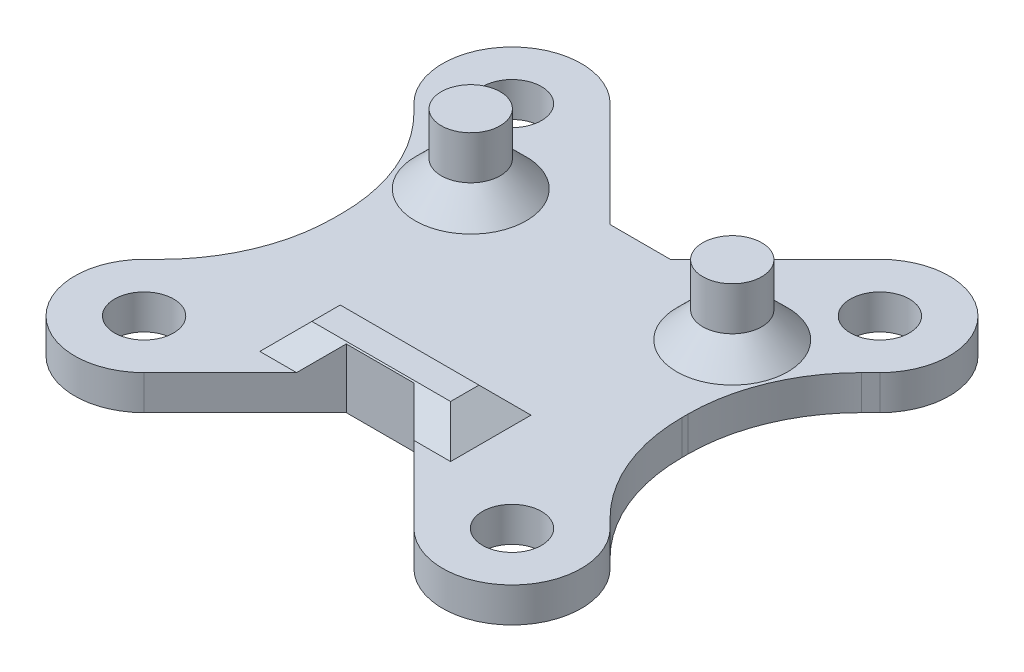
ISO-10303-21;
HEADER;
FILE_DESCRIPTION(('STEP AP214'),'2;1');
FILE_NAME('part.step','',(''),(''),'','','');
FILE_SCHEMA(('AUTOMOTIVE_DESIGN { 1 0 10303 214 1 1 1 1 }'));
ENDSEC;
DATA;
#1=APPLICATION_CONTEXT('core data for automotive mechanical design processes');
#2=APPLICATION_PROTOCOL_DEFINITION('international standard','automotive_design',2000,#1);
#3=PRODUCT_CONTEXT('',#1,'mechanical');
#4=PRODUCT('Part','Part','',(#3));
#5=PRODUCT_RELATED_PRODUCT_CATEGORY('part','',(#4));
#6=PRODUCT_DEFINITION_FORMATION('','',#4);
#7=PRODUCT_DEFINITION_CONTEXT('part definition',#1,'design');
#8=PRODUCT_DEFINITION('design','',#6,#7);
#9=PRODUCT_DEFINITION_SHAPE('','',#8);
#10=(LENGTH_UNIT() NAMED_UNIT(*) SI_UNIT(.MILLI.,.METRE.));
#11=(NAMED_UNIT(*) PLANE_ANGLE_UNIT() SI_UNIT($,.RADIAN.));
#12=(NAMED_UNIT(*) SI_UNIT($,.STERADIAN.) SOLID_ANGLE_UNIT());
#13=UNCERTAINTY_MEASURE_WITH_UNIT(LENGTH_MEASURE(1.E-05),#10,'distance_accuracy_value','');
#14=(GEOMETRIC_REPRESENTATION_CONTEXT(3) GLOBAL_UNCERTAINTY_ASSIGNED_CONTEXT((#13)) GLOBAL_UNIT_ASSIGNED_CONTEXT((#10,
#11,#12)) REPRESENTATION_CONTEXT('',''));
#15=CARTESIAN_POINT('',(0.,0.,0.));
#16=DIRECTION('',(0.,0.,1.));
#17=DIRECTION('',(1.,0.,0.));
#18=AXIS2_PLACEMENT_3D('',#15,#16,#17);
#19=CARTESIAN_POINT('',(10.6066017177982,2.,-10.6066017177983));
#20=DIRECTION('',(0.,1.,0.));
#21=DIRECTION('',(0.,0.,1.));
#22=AXIS2_PLACEMENT_3D('',#19,#20,#21);
#23=PLANE('',#22);
#24=DIRECTION('',(0.707106781186548,0.,-0.707106781186547));
#25=VECTOR('',#24,1.);
#26=CARTESIAN_POINT('',(-7.77817459305203,2.,13.4350288425443));
#27=LINE('',#26,#25);
#28=CARTESIAN_POINT('',(-7.77817459305203,2.,13.4350288425443));
#29=VERTEX_POINT('',#28);
#30=CARTESIAN_POINT('',(-3.38314575050772,2.,9.04));
#31=VERTEX_POINT('',#30);
#32=EDGE_CURVE('E318',#29,#31,#27,.T.);
#33=ORIENTED_EDGE('',*,*,#32,.T.);
#34=DIRECTION('',(-1.,0.,0.));
#35=VECTOR('',#34,1.);
#36=CARTESIAN_POINT('',(10.6066017177982,2.,9.04));
#37=LINE('',#36,#35);
#38=CARTESIAN_POINT('',(-5.49999999999999,2.,9.04));
#39=VERTEX_POINT('',#38);
#40=EDGE_CURVE('E522',#31,#39,#37,.T.);
#41=ORIENTED_EDGE('',*,*,#40,.T.);
#42=DIRECTION('',(0.,0.,-1.));
#43=VECTOR('',#42,1.);
#44=CARTESIAN_POINT('',(-5.49999999999999,2.,5.9040647699451));
#45=LINE('',#44,#43);
#46=CARTESIAN_POINT('',(-5.49999999999999,2.,4.4040647699451));
#47=VERTEX_POINT('',#46);
#48=EDGE_CURVE('E519',#39,#47,#45,.T.);
#49=ORIENTED_EDGE('',*,*,#48,.T.);
#50=DIRECTION('',(1.,0.,0.));
#51=VECTOR('',#50,1.);
#52=CARTESIAN_POINT('',(4.00000000000001,2.,4.4040647699451));
#53=LINE('',#52,#51);
#54=CARTESIAN_POINT('',(5.5,2.,4.4040647699451));
#55=VERTEX_POINT('',#54);
#56=EDGE_CURVE('E515',#47,#55,#53,.T.);
#57=ORIENTED_EDGE('',*,*,#56,.T.);
#58=DIRECTION('',(0.,0.,1.));
#59=VECTOR('',#58,1.);
#60=CARTESIAN_POINT('',(5.5,2.,-10.6066017177983));
#61=LINE('',#60,#59);
#62=CARTESIAN_POINT('',(5.5,2.,9.04));
#63=VERTEX_POINT('',#62);
#64=EDGE_CURVE('E510',#55,#63,#61,.T.);
#65=ORIENTED_EDGE('',*,*,#64,.T.);
#66=DIRECTION('',(-1.,0.,0.));
#67=VECTOR('',#66,1.);
#68=CARTESIAN_POINT('',(10.6066017177982,2.,9.04));
#69=LINE('',#68,#67);
#70=CARTESIAN_POINT('',(3.38314575050756,2.,9.04));
#71=VERTEX_POINT('',#70);
#72=EDGE_CURVE('E236',#63,#71,#69,.T.);
#73=ORIENTED_EDGE('',*,*,#72,.T.);
#74=DIRECTION('',(0.707106781186544,0.,0.707106781186551));
#75=VECTOR('',#74,1.);
#76=CARTESIAN_POINT('',(1.94974746830584,2.,7.60660171779826));
#77=LINE('',#76,#75);
#78=CARTESIAN_POINT('',(7.77817459305195,2.,13.4350288425444));
#79=VERTEX_POINT('',#78);
#80=EDGE_CURVE('E315',#71,#79,#77,.T.);
#81=ORIENTED_EDGE('',*,*,#80,.T.);
#82=CARTESIAN_POINT('',(10.6066017177982,2.,10.6066017177983));
#83=DIRECTION('',(0.,1.,0.));
#84=DIRECTION('',(0.,0.,1.));
#85=AXIS2_PLACEMENT_3D('',#82,#83,#84);
#86=CIRCLE('',#85,4.);
#87=CARTESIAN_POINT('',(13.4350288425444,2.,7.77817459305208));
#88=VERTEX_POINT('',#87);
#89=EDGE_CURVE('E311',#79,#88,#86,.T.);
#90=ORIENTED_EDGE('',*,*,#89,.T.);
#91=DIRECTION('',(0.707106781186546,0.,0.707106781186549));
#92=VECTOR('',#91,1.);
#93=CARTESIAN_POINT('',(9.97136734953961,2.,4.31451310004731));
#94=LINE('',#93,#92);
#95=CARTESIAN_POINT('',(12.9002995376741,2.,7.24344528818184));
#96=VERTEX_POINT('',#95);
#97=EDGE_CURVE('E308',#96,#88,#94,.T.);
#98=ORIENTED_EDGE('',*,*,#97,.F.);
#99=CARTESIAN_POINT('',(19.9713673495396,2.,0.172377476316383));
#100=DIRECTION('',(0.,1.,0.));
#101=DIRECTION('',(0.,0.,1.));
#102=AXIS2_PLACEMENT_3D('',#99,#100,#101);
#103=CIRCLE('',#102,10.);
#104=CARTESIAN_POINT('',(9.97136734953962,2.,0.172377476316366));
#105=VERTEX_POINT('',#104);
#106=EDGE_CURVE('E479',#96,#105,#103,.F.);
#107=ORIENTED_EDGE('',*,*,#106,.T.);
#108=DIRECTION('',(0.,0.,-1.));
#109=VECTOR('',#108,1.);
#110=CARTESIAN_POINT('',(9.97136734953961,2.,4.31451310004731));
#111=LINE('',#110,#109);
#112=CARTESIAN_POINT('',(9.97136734953962,2.,-0.172377476316413));
#113=VERTEX_POINT('',#112);
#114=EDGE_CURVE('E304',#105,#113,#111,.T.);
#115=ORIENTED_EDGE('',*,*,#114,.T.);
#116=CARTESIAN_POINT('',(19.9713673495396,2.,-0.172377476316397));
#117=DIRECTION('',(0.,1.,0.));
#118=DIRECTION('',(0.,0.,1.));
#119=AXIS2_PLACEMENT_3D('',#116,#117,#118);
#120=CIRCLE('',#119,10.);
#121=CARTESIAN_POINT('',(12.9002995376741,2.,-7.24344528818187));
#122=VERTEX_POINT('',#121);
#123=EDGE_CURVE('E473',#113,#122,#120,.F.);
#124=ORIENTED_EDGE('',*,*,#123,.T.);
#125=DIRECTION('',(0.707106781186547,0.,-0.707106781186548));
#126=VECTOR('',#125,1.);
#127=CARTESIAN_POINT('',(9.97136734953963,2.,-4.31451310004735));
#128=LINE('',#127,#126);
#129=CARTESIAN_POINT('',(13.4350288425444,2.,-7.77817459305211));
#130=VERTEX_POINT('',#129);
#131=EDGE_CURVE('E301',#122,#130,#128,.T.);
#132=ORIENTED_EDGE('',*,*,#131,.T.);
#133=CARTESIAN_POINT('',(10.6066017177982,2.,-10.6066017177983));
#134=DIRECTION('',(0.,1.,0.));
#135=DIRECTION('',(0.,0.,1.));
#136=AXIS2_PLACEMENT_3D('',#133,#134,#135);
#137=CIRCLE('',#136,4.);
#138=CARTESIAN_POINT('',(7.77817459305204,2.,-13.4350288425445));
#139=VERTEX_POINT('',#138);
#140=EDGE_CURVE('E297',#130,#139,#137,.T.);
#141=ORIENTED_EDGE('',*,*,#140,.T.);
#142=DIRECTION('',(0.707106781186548,0.,-0.707106781186547));
#143=VECTOR('',#142,1.);
#144=CARTESIAN_POINT('',(1.7365440327093,2.,-7.39339828220179));
#145=LINE('',#144,#143);
#146=CARTESIAN_POINT('',(1.7365440327093,2.,-7.39339828220179));
#147=VERTEX_POINT('',#146);
#148=EDGE_CURVE('E293',#147,#139,#145,.T.);
#149=ORIENTED_EDGE('',*,*,#148,.F.);
#150=DIRECTION('',(-1.,0.,0.));
#151=VECTOR('',#150,1.);
#152=CARTESIAN_POINT('',(1.7365440327093,2.,-7.39339828220179));
#153=LINE('',#152,#151);
#154=CARTESIAN_POINT('',(-1.73654403270938,2.,-7.39339828220181));
#155=VERTEX_POINT('',#154);
#156=EDGE_CURVE('E344',#147,#155,#153,.T.);
#157=ORIENTED_EDGE('',*,*,#156,.T.);
#158=DIRECTION('',(0.707106781186544,0.,0.707106781186551));
#159=VECTOR('',#158,1.);
#160=CARTESIAN_POINT('',(-7.77817459305195,2.,-13.4350288425444));
#161=LINE('',#160,#159);
#162=CARTESIAN_POINT('',(-7.77817459305195,2.,-13.4350288425444));
#163=VERTEX_POINT('',#162);
#164=EDGE_CURVE('E340',#163,#155,#161,.T.);
#165=ORIENTED_EDGE('',*,*,#164,.F.);
#166=CARTESIAN_POINT('',(-10.6066017177982,2.,-10.6066017177983));
#167=DIRECTION('',(0.,1.,0.));
#168=DIRECTION('',(0.,0.,1.));
#169=AXIS2_PLACEMENT_3D('',#166,#167,#168);
#170=CIRCLE('',#169,4.);
#171=CARTESIAN_POINT('',(-13.4350288425444,2.,-7.77817459305209));
#172=VERTEX_POINT('',#171);
#173=EDGE_CURVE('E337',#163,#172,#170,.T.);
#174=ORIENTED_EDGE('',*,*,#173,.T.);
#175=DIRECTION('',(0.707106781186543,0.,0.707106781186552));
#176=VECTOR('',#175,1.);
#177=CARTESIAN_POINT('',(-13.4350288425444,2.,-7.77817459305209));
#178=LINE('',#177,#176);
#179=CARTESIAN_POINT('',(-12.9575648385949,2.,-7.30071058910259));
#180=VERTEX_POINT('',#179);
#181=EDGE_CURVE('E333',#172,#180,#178,.T.);
#182=ORIENTED_EDGE('',*,*,#181,.T.);
#183=CARTESIAN_POINT('',(-20.0286326504604,2.,-0.229642777237154));
#184=DIRECTION('',(0.,1.,0.));
#185=DIRECTION('',(0.,0.,1.));
#186=AXIS2_PLACEMENT_3D('',#183,#184,#185);
#187=CIRCLE('',#186,10.);
#188=CARTESIAN_POINT('',(-10.0286326504604,2.,-0.229642777237154));
#189=VERTEX_POINT('',#188);
#190=EDGE_CURVE('E491',#180,#189,#187,.F.);
#191=ORIENTED_EDGE('',*,*,#190,.T.);
#192=DIRECTION('',(0.,0.,-1.));
#193=VECTOR('',#192,1.);
#194=CARTESIAN_POINT('',(-10.0286326504604,2.,4.37177840096789));
#195=LINE('',#194,#193);
#196=CARTESIAN_POINT('',(-10.0286326504604,2.,0.229642777236943));
#197=VERTEX_POINT('',#196);
#198=EDGE_CURVE('E329',#197,#189,#195,.T.);
#199=ORIENTED_EDGE('',*,*,#198,.F.);
#200=CARTESIAN_POINT('',(-20.0286326504604,2.,0.229642777236943));
#201=DIRECTION('',(0.,1.,0.));
#202=DIRECTION('',(0.,0.,1.));
#203=AXIS2_PLACEMENT_3D('',#200,#201,#202);
#204=CIRCLE('',#203,10.);
#205=CARTESIAN_POINT('',(-12.9575648385949,2.,7.30071058910242));
#206=VERTEX_POINT('',#205);
#207=EDGE_CURVE('E485',#197,#206,#204,.F.);
#208=ORIENTED_EDGE('',*,*,#207,.T.);
#209=DIRECTION('',(0.707106781186548,0.,-0.707106781186547));
#210=VECTOR('',#209,1.);
#211=CARTESIAN_POINT('',(-13.4350288425444,2.,7.77817459305193));
#212=LINE('',#211,#210);
#213=CARTESIAN_POINT('',(-13.4350288425444,2.,7.77817459305193));
#214=VERTEX_POINT('',#213);
#215=EDGE_CURVE('E325',#214,#206,#212,.T.);
#216=ORIENTED_EDGE('',*,*,#215,.F.);
#217=CARTESIAN_POINT('',(-10.6066017177982,2.,10.6066017177981));
#218=DIRECTION('',(0.,1.,0.));
#219=DIRECTION('',(0.,0.,1.));
#220=AXIS2_PLACEMENT_3D('',#217,#218,#219);
#221=CIRCLE('',#220,4.);
#222=EDGE_CURVE('E322',#214,#29,#221,.T.);
#223=ORIENTED_EDGE('',*,*,#222,.T.);
#224=EDGE_LOOP('',(#33,#41,#49,#57,#65,#73,#81,#90,#98,#107,#115,#124,#132,#141,#149,#157,#165,
#174,#182,#191,#199,#208,#216,#223));
#225=FACE_BOUND('',#224,.T.);
#226=CARTESIAN_POINT('',(7.53999999999999,2.,-5.16));
#227=DIRECTION('',(0.,1.,0.));
#228=DIRECTION('',(0.,0.,1.));
#229=AXIS2_PLACEMENT_3D('',#226,#227,#228);
#230=CIRCLE('',#229,3.19999999999999);
#231=CARTESIAN_POINT('',(7.53999999999999,2.,-1.96000000000001));
#232=VERTEX_POINT('',#231);
#233=EDGE_CURVE('E502',#232,#232,#230,.F.);
#234=ORIENTED_EDGE('',*,*,#233,.T.);
#235=EDGE_LOOP('',(#234));
#236=FACE_BOUND('',#235,.T.);
#237=CARTESIAN_POINT('',(-7.54,2.,-5.16));
#238=DIRECTION('',(0.,1.,0.));
#239=DIRECTION('',(0.,0.,1.));
#240=AXIS2_PLACEMENT_3D('',#237,#238,#239);
#241=CIRCLE('',#240,3.19999999999999);
#242=CARTESIAN_POINT('',(-7.54,2.,-1.96000000000001));
#243=VERTEX_POINT('',#242);
#244=EDGE_CURVE('E498',#243,#243,#241,.F.);
#245=ORIENTED_EDGE('',*,*,#244,.T.);
#246=EDGE_LOOP('',(#245));
#247=FACE_BOUND('',#246,.T.);
#248=CARTESIAN_POINT('',(-10.6066017177982,2.,10.6066017177981));
#249=DIRECTION('',(0.,1.,0.));
#250=DIRECTION('',(0.,0.,1.));
#251=AXIS2_PLACEMENT_3D('',#248,#249,#250);
#252=CIRCLE('',#251,1.69999999999999);
#253=CARTESIAN_POINT('',(-10.6066017177982,2.,12.3066017177981));
#254=VERTEX_POINT('',#253);
#255=EDGE_CURVE('E260',#254,#254,#252,.T.);
#256=ORIENTED_EDGE('',*,*,#255,.F.);
#257=EDGE_LOOP('',(#256));
#258=FACE_BOUND('',#257,.T.);
#259=CARTESIAN_POINT('',(10.6066017177982,2.,10.6066017177983));
#260=DIRECTION('',(0.,1.,0.));
#261=DIRECTION('',(0.,0.,1.));
#262=AXIS2_PLACEMENT_3D('',#259,#260,#261);
#263=CIRCLE('',#262,1.69999999999999);
#264=CARTESIAN_POINT('',(10.6066017177982,2.,12.3066017177982));
#265=VERTEX_POINT('',#264);
#266=EDGE_CURVE('E268',#265,#265,#263,.T.);
#267=ORIENTED_EDGE('',*,*,#266,.F.);
#268=EDGE_LOOP('',(#267));
#269=FACE_BOUND('',#268,.T.);
#270=CARTESIAN_POINT('',(10.6066017177982,2.,-10.6066017177983));
#271=DIRECTION('',(0.,1.,0.));
#272=DIRECTION('',(0.,0.,1.));
#273=AXIS2_PLACEMENT_3D('',#270,#271,#272);
#274=CIRCLE('',#273,1.69999999999999);
#275=CARTESIAN_POINT('',(10.6066017177982,2.,-8.90660171779829));
#276=VERTEX_POINT('',#275);
#277=EDGE_CURVE('E276',#276,#276,#274,.T.);
#278=ORIENTED_EDGE('',*,*,#277,.F.);
#279=EDGE_LOOP('',(#278));
#280=FACE_BOUND('',#279,.T.);
#281=CARTESIAN_POINT('',(-10.6066017177982,2.,-10.6066017177983));
#282=DIRECTION('',(0.,1.,0.));
#283=DIRECTION('',(0.,0.,1.));
#284=AXIS2_PLACEMENT_3D('',#281,#282,#283);
#285=CIRCLE('',#284,1.69999999999999);
#286=CARTESIAN_POINT('',(-10.6066017177982,2.,-8.90660171779827));
#287=VERTEX_POINT('',#286);
#288=EDGE_CURVE('E284',#287,#287,#285,.T.);
#289=ORIENTED_EDGE('',*,*,#288,.F.);
#290=EDGE_LOOP('',(#289));
#291=FACE_BOUND('',#290,.T.);
#292=ADVANCED_FACE('F49',(#225,#236,#247,#258,#269,#280,#291),#23,.T.);
#293=CARTESIAN_POINT('',(1.7365440327093,2.,-7.39339828220179));
#294=DIRECTION('',(-0.707106781186547,0.,-0.707106781186548));
#295=DIRECTION('',(-0.707106781186548,0.,0.707106781186547));
#296=AXIS2_PLACEMENT_3D('',#293,#294,#295);
#297=PLANE('',#296);
#298=DIRECTION('',(0.707106781186548,0.,-0.707106781186547));
#299=VECTOR('',#298,1.);
#300=CARTESIAN_POINT('',(1.7365440327093,0.,-7.39339828220179));
#301=LINE('',#300,#299);
#302=CARTESIAN_POINT('',(1.7365440327093,0.,-7.39339828220179));
#303=VERTEX_POINT('',#302);
#304=CARTESIAN_POINT('',(7.77817459305204,0.,-13.4350288425445));
#305=VERTEX_POINT('',#304);
#306=EDGE_CURVE('E292',#303,#305,#301,.T.);
#307=ORIENTED_EDGE('',*,*,#306,.F.);
#308=DIRECTION('',(0.,-1.,0.));
#309=VECTOR('',#308,1.);
#310=CARTESIAN_POINT('',(1.7365440327093,2.,-7.39339828220179));
#311=LINE('',#310,#309);
#312=EDGE_CURVE('E404',#147,#303,#311,.T.);
#313=ORIENTED_EDGE('',*,*,#312,.F.);
#314=ORIENTED_EDGE('',*,*,#148,.T.);
#315=DIRECTION('',(0.,-1.,0.));
#316=VECTOR('',#315,1.);
#317=CARTESIAN_POINT('',(7.77817459305204,2.,-13.4350288425445));
#318=LINE('',#317,#316);
#319=EDGE_CURVE('E347',#139,#305,#318,.T.);
#320=ORIENTED_EDGE('',*,*,#319,.T.);
#321=EDGE_LOOP('',(#307,#313,#314,#320));
#322=FACE_BOUND('',#321,.T.);
#323=ADVANCED_FACE('F602',(#322),#297,.T.);
#324=CARTESIAN_POINT('',(1.7365440327093,2.,-7.39339828220179));
#325=DIRECTION('',(0.,0.,1.));
#326=DIRECTION('',(1.,0.,0.));
#327=AXIS2_PLACEMENT_3D('',#324,#325,#326);
#328=PLANE('',#327);
#329=DIRECTION('',(-1.,0.,0.));
#330=VECTOR('',#329,1.);
#331=CARTESIAN_POINT('',(1.7365440327093,0.,-7.39339828220179));
#332=LINE('',#331,#330);
#333=CARTESIAN_POINT('',(-1.73654403270938,0.,-7.39339828220181));
#334=VERTEX_POINT('',#333);
#335=EDGE_CURVE('E298',#303,#334,#332,.T.);
#336=ORIENTED_EDGE('',*,*,#335,.T.);
#337=DIRECTION('',(0.,-1.,0.));
#338=VECTOR('',#337,1.);
#339=CARTESIAN_POINT('',(-1.73654403270938,2.,-7.39339828220181));
#340=LINE('',#339,#338);
#341=EDGE_CURVE('E408',#155,#334,#340,.T.);
#342=ORIENTED_EDGE('',*,*,#341,.F.);
#343=ORIENTED_EDGE('',*,*,#156,.F.);
#344=ORIENTED_EDGE('',*,*,#312,.T.);
#345=EDGE_LOOP('',(#336,#342,#343,#344));
#346=FACE_BOUND('',#345,.T.);
#347=ADVANCED_FACE('F605',(#346),#328,.F.);
#348=CARTESIAN_POINT('',(-7.77817459305195,2.,-13.4350288425444));
#349=DIRECTION('',(0.707106781186551,0.,-0.707106781186544));
#350=DIRECTION('',(-0.707106781186544,0.,-0.707106781186551));
#351=AXIS2_PLACEMENT_3D('',#348,#349,#350);
#352=PLANE('',#351);
#353=DIRECTION('',(0.707106781186544,0.,0.707106781186551));
#354=VECTOR('',#353,1.);
#355=CARTESIAN_POINT('',(-7.77817459305195,0.,-13.4350288425444));
#356=LINE('',#355,#354);
#357=CARTESIAN_POINT('',(-7.77817459305195,0.,-13.4350288425444));
#358=VERTEX_POINT('',#357);
#359=EDGE_CURVE('E397',#358,#334,#356,.T.);
#360=ORIENTED_EDGE('',*,*,#359,.F.);
#361=DIRECTION('',(0.,-1.,0.));
#362=VECTOR('',#361,1.);
#363=CARTESIAN_POINT('',(-7.77817459305195,2.,-13.4350288425444));
#364=LINE('',#363,#362);
#365=EDGE_CURVE('E411',#163,#358,#364,.T.);
#366=ORIENTED_EDGE('',*,*,#365,.F.);
#367=ORIENTED_EDGE('',*,*,#164,.T.);
#368=ORIENTED_EDGE('',*,*,#341,.T.);
#369=EDGE_LOOP('',(#360,#366,#367,#368));
#370=FACE_BOUND('',#369,.T.);
#371=ADVANCED_FACE('F608',(#370),#352,.T.);
#372=CARTESIAN_POINT('',(-10.6066017177982,2.,-10.6066017177983));
#373=DIRECTION('',(0.,-1.,0.));
#374=DIRECTION('',(0.,0.,-1.));
#375=AXIS2_PLACEMENT_3D('',#372,#373,#374);
#376=CYLINDRICAL_SURFACE('',#375,4.);
#377=CARTESIAN_POINT('',(-10.6066017177982,0.,-10.6066017177983));
#378=DIRECTION('',(0.,1.,0.));
#379=DIRECTION('',(0.,0.,1.));
#380=AXIS2_PLACEMENT_3D('',#377,#378,#379);
#381=CIRCLE('',#380,4.);
#382=CARTESIAN_POINT('',(-13.4350288425444,0.,-7.77817459305209));
#383=VERTEX_POINT('',#382);
#384=EDGE_CURVE('E394',#358,#383,#381,.T.);
#385=ORIENTED_EDGE('',*,*,#384,.T.);
#386=DIRECTION('',(0.,-1.,0.));
#387=VECTOR('',#386,1.);
#388=CARTESIAN_POINT('',(-13.4350288425444,2.,-7.77817459305209));
#389=LINE('',#388,#387);
#390=EDGE_CURVE('E414',#172,#383,#389,.T.);
#391=ORIENTED_EDGE('',*,*,#390,.F.);
#392=ORIENTED_EDGE('',*,*,#173,.F.);
#393=ORIENTED_EDGE('',*,*,#365,.T.);
#394=EDGE_LOOP('',(#385,#391,#392,#393));
#395=FACE_BOUND('',#394,.T.);
#396=ADVANCED_FACE('F614',(#395),#376,.T.);
#397=CARTESIAN_POINT('',(-13.4350288425444,2.,-7.77817459305209));
#398=DIRECTION('',(0.707106781186552,0.,-0.707106781186543));
#399=DIRECTION('',(-0.707106781186543,0.,-0.707106781186552));
#400=AXIS2_PLACEMENT_3D('',#397,#398,#399);
#401=PLANE('',#400);
#402=DIRECTION('',(0.707106781186543,0.,0.707106781186552));
#403=VECTOR('',#402,1.);
#404=CARTESIAN_POINT('',(-13.4350288425444,0.,-7.77817459305209));
#405=LINE('',#404,#403);
#406=CARTESIAN_POINT('',(-12.9575648385949,0.,-7.30071058910259));
#407=VERTEX_POINT('',#406);
#408=EDGE_CURVE('E390',#383,#407,#405,.T.);
#409=ORIENTED_EDGE('',*,*,#408,.T.);
#410=DIRECTION('',(0.,-1.,0.));
#411=VECTOR('',#410,1.);
#412=CARTESIAN_POINT('',(-12.9575648385949,2.,-7.30071058910259));
#413=LINE('',#412,#411);
#414=EDGE_CURVE('E467',#407,#180,#413,.F.);
#415=ORIENTED_EDGE('',*,*,#414,.T.);
#416=ORIENTED_EDGE('',*,*,#181,.F.);
#417=ORIENTED_EDGE('',*,*,#390,.T.);
#418=EDGE_LOOP('',(#409,#415,#416,#417));
#419=FACE_BOUND('',#418,.T.);
#420=ADVANCED_FACE('F618',(#419),#401,.F.);
#421=CARTESIAN_POINT('',(-10.0286326504604,2.,4.37177840096789));
#422=DIRECTION('',(-1.,0.,0.));
#423=DIRECTION('',(0.,0.,1.));
#424=AXIS2_PLACEMENT_3D('',#421,#422,#423);
#425=PLANE('',#424);
#426=DIRECTION('',(0.,0.,-1.));
#427=VECTOR('',#426,1.);
#428=CARTESIAN_POINT('',(-10.0286326504604,0.,4.37177840096789));
#429=LINE('',#428,#427);
#430=CARTESIAN_POINT('',(-10.0286326504604,0.,0.229642777236943));
#431=VERTEX_POINT('',#430);
#432=CARTESIAN_POINT('',(-10.0286326504604,0.,-0.229642777237154));
#433=VERTEX_POINT('',#432);
#434=EDGE_CURVE('E386',#431,#433,#429,.T.);
#435=ORIENTED_EDGE('',*,*,#434,.F.);
#436=DIRECTION('',(0.,-1.,0.));
#437=VECTOR('',#436,1.);
#438=CARTESIAN_POINT('',(-10.0286326504604,2.,0.229642777236943));
#439=LINE('',#438,#437);
#440=EDGE_CURVE('E464',#431,#197,#439,.F.);
#441=ORIENTED_EDGE('',*,*,#440,.T.);
#442=ORIENTED_EDGE('',*,*,#198,.T.);
#443=DIRECTION('',(0.,-1.,0.));
#444=VECTOR('',#443,1.);
#445=CARTESIAN_POINT('',(-10.0286326504604,2.,-0.229642777237154));
#446=LINE('',#445,#444);
#447=EDGE_CURVE('E460',#189,#433,#446,.T.);
#448=ORIENTED_EDGE('',*,*,#447,.T.);
#449=EDGE_LOOP('',(#435,#441,#442,#448));
#450=FACE_BOUND('',#449,.T.);
#451=ADVANCED_FACE('F627',(#450),#425,.T.);
#452=CARTESIAN_POINT('',(-13.4350288425444,2.,7.77817459305193));
#453=DIRECTION('',(-0.707106781186547,0.,-0.707106781186548));
#454=DIRECTION('',(-0.707106781186548,0.,0.707106781186547));
#455=AXIS2_PLACEMENT_3D('',#452,#453,#454);
#456=PLANE('',#455);
#457=ORIENTED_EDGE('',*,*,#215,.T.);
#458=DIRECTION('',(0.,-1.,0.));
#459=VECTOR('',#458,1.);
#460=CARTESIAN_POINT('',(-12.9575648385949,0.,7.30071058910242));
#461=LINE('',#460,#459);
#462=CARTESIAN_POINT('',(-12.9575648385949,0.,7.30071058910242));
#463=VERTEX_POINT('',#462);
#464=EDGE_CURVE('E456',#206,#463,#461,.T.);
#465=ORIENTED_EDGE('',*,*,#464,.T.);
#466=DIRECTION('',(0.707106781186548,0.,-0.707106781186547));
#467=VECTOR('',#466,1.);
#468=CARTESIAN_POINT('',(-13.4350288425444,0.,7.77817459305193));
#469=LINE('',#468,#467);
#470=CARTESIAN_POINT('',(-13.4350288425444,0.,7.77817459305193));
#471=VERTEX_POINT('',#470);
#472=EDGE_CURVE('E382',#471,#463,#469,.T.);
#473=ORIENTED_EDGE('',*,*,#472,.F.);
#474=DIRECTION('',(0.,-1.,0.));
#475=VECTOR('',#474,1.);
#476=CARTESIAN_POINT('',(-13.4350288425444,2.,7.77817459305193));
#477=LINE('',#476,#475);
#478=EDGE_CURVE('E418',#214,#471,#477,.T.);
#479=ORIENTED_EDGE('',*,*,#478,.F.);
#480=EDGE_LOOP('',(#457,#465,#473,#479));
#481=FACE_BOUND('',#480,.T.);
#482=ADVANCED_FACE('F633',(#481),#456,.T.);
#483=CARTESIAN_POINT('',(-10.6066017177982,2.,10.6066017177981));
#484=DIRECTION('',(0.,-1.,0.));
#485=DIRECTION('',(0.,0.,-1.));
#486=AXIS2_PLACEMENT_3D('',#483,#484,#485);
#487=CYLINDRICAL_SURFACE('',#486,4.);
#488=CARTESIAN_POINT('',(-10.6066017177982,0.,10.6066017177981));
#489=DIRECTION('',(0.,1.,0.));
#490=DIRECTION('',(0.,0.,1.));
#491=AXIS2_PLACEMENT_3D('',#488,#489,#490);
#492=CIRCLE('',#491,4.);
#493=CARTESIAN_POINT('',(-7.77817459305203,0.,13.4350288425443));
#494=VERTEX_POINT('',#493);
#495=EDGE_CURVE('E379',#471,#494,#492,.T.);
#496=ORIENTED_EDGE('',*,*,#495,.T.);
#497=DIRECTION('',(0.,-1.,0.));
#498=VECTOR('',#497,1.);
#499=CARTESIAN_POINT('',(-7.77817459305203,2.,13.4350288425443));
#500=LINE('',#499,#498);
#501=EDGE_CURVE('E421',#29,#494,#500,.T.);
#502=ORIENTED_EDGE('',*,*,#501,.F.);
#503=ORIENTED_EDGE('',*,*,#222,.F.);
#504=ORIENTED_EDGE('',*,*,#478,.T.);
#505=EDGE_LOOP('',(#496,#502,#503,#504));
#506=FACE_BOUND('',#505,.T.);
#507=ADVANCED_FACE('F634',(#506),#487,.T.);
#508=CARTESIAN_POINT('',(-7.77817459305203,2.,13.4350288425443));
#509=DIRECTION('',(-0.707106781186547,0.,-0.707106781186548));
#510=DIRECTION('',(-0.707106781186548,0.,0.707106781186547));
#511=AXIS2_PLACEMENT_3D('',#508,#509,#510);
#512=PLANE('',#511);
#513=DIRECTION('',(0.707106781186548,0.,-0.707106781186547));
#514=VECTOR('',#513,1.);
#515=CARTESIAN_POINT('',(-7.77817459305203,0.,13.4350288425443));
#516=LINE('',#515,#514);
#517=CARTESIAN_POINT('',(-1.94974746830598,0.,7.60660171779826));
#518=VERTEX_POINT('',#517);
#519=EDGE_CURVE('E376',#494,#518,#516,.T.);
#520=ORIENTED_EDGE('',*,*,#519,.T.);
#521=DIRECTION('',(0.,-1.,0.));
#522=VECTOR('',#521,1.);
#523=CARTESIAN_POINT('',(-1.94974746830598,2.,7.60660171779826));
#524=LINE('',#523,#522);
#525=CARTESIAN_POINT('',(-1.94974746830598,3.43339828220175,7.60660171779826));
#526=VERTEX_POINT('',#525);
#527=EDGE_CURVE('E67',#526,#518,#524,.T.);
#528=ORIENTED_EDGE('',*,*,#527,.F.);
#529=DIRECTION('',(-0.577350269189624,-0.57735026918963,0.577350269189624));
#530=VECTOR('',#529,1.);
#531=CARTESIAN_POINT('',(-6.31316497887057,-0.930019228362885,11.9700192283629));
#532=LINE('',#531,#530);
#533=EDGE_CURVE('E11',#526,#31,#532,.T.);
#534=ORIENTED_EDGE('',*,*,#533,.T.);
#535=ORIENTED_EDGE('',*,*,#32,.F.);
#536=ORIENTED_EDGE('',*,*,#501,.T.);
#537=EDGE_LOOP('',(#520,#528,#534,#535,#536));
#538=FACE_BOUND('',#537,.T.);
#539=ADVANCED_FACE('F550',(#538),#512,.F.);
#540=CARTESIAN_POINT('',(1.94974746830584,2.,7.60660171779826));
#541=DIRECTION('',(0.,0.,1.));
#542=DIRECTION('',(1.,0.,0.));
#543=AXIS2_PLACEMENT_3D('',#540,#541,#542);
#544=PLANE('',#543);
#545=DIRECTION('',(-1.,0.,0.));
#546=VECTOR('',#545,1.);
#547=CARTESIAN_POINT('',(1.94974746830584,0.,7.60660171779826));
#548=LINE('',#547,#546);
#549=CARTESIAN_POINT('',(1.94974746830584,0.,7.60660171779826));
#550=VERTEX_POINT('',#549);
#551=EDGE_CURVE('E372',#550,#518,#548,.T.);
#552=ORIENTED_EDGE('',*,*,#551,.F.);
#553=DIRECTION('',(0.,-1.,0.));
#554=VECTOR('',#553,1.);
#555=CARTESIAN_POINT('',(1.94974746830584,2.,7.60660171779826));
#556=LINE('',#555,#554);
#557=CARTESIAN_POINT('',(1.94974746830584,3.43339828220175,7.60660171779826));
#558=VERTEX_POINT('',#557);
#559=EDGE_CURVE('E74',#558,#550,#556,.T.);
#560=ORIENTED_EDGE('',*,*,#559,.F.);
#561=DIRECTION('',(-1.,0.,0.));
#562=VECTOR('',#561,1.);
#563=CARTESIAN_POINT('',(0.,3.43339828220175,7.60660171779826));
#564=LINE('',#563,#562);
#565=EDGE_CURVE('E60',#558,#526,#564,.T.);
#566=ORIENTED_EDGE('',*,*,#565,.T.);
#567=ORIENTED_EDGE('',*,*,#527,.T.);
#568=EDGE_LOOP('',(#552,#560,#566,#567));
#569=FACE_BOUND('',#568,.T.);
#570=ADVANCED_FACE('F559',(#569),#544,.T.);
#571=CARTESIAN_POINT('',(1.94974746830584,2.,7.60660171779826));
#572=DIRECTION('',(0.707106781186552,0.,-0.707106781186544));
#573=DIRECTION('',(-0.707106781186544,0.,-0.707106781186551));
#574=AXIS2_PLACEMENT_3D('',#571,#572,#573);
#575=PLANE('',#574);
#576=DIRECTION('',(0.707106781186544,0.,0.707106781186551));
#577=VECTOR('',#576,1.);
#578=CARTESIAN_POINT('',(1.94974746830584,0.,7.60660171779826));
#579=LINE('',#578,#577);
#580=CARTESIAN_POINT('',(7.77817459305195,0.,13.4350288425444));
#581=VERTEX_POINT('',#580);
#582=EDGE_CURVE('E369',#550,#581,#579,.T.);
#583=ORIENTED_EDGE('',*,*,#582,.T.);
#584=DIRECTION('',(0.,-1.,0.));
#585=VECTOR('',#584,1.);
#586=CARTESIAN_POINT('',(7.77817459305195,2.,13.4350288425444));
#587=LINE('',#586,#585);
#588=EDGE_CURVE('E429',#79,#581,#587,.T.);
#589=ORIENTED_EDGE('',*,*,#588,.F.);
#590=ORIENTED_EDGE('',*,*,#80,.F.);
#591=DIRECTION('',(-0.57735026918962,0.577350269189632,-0.577350269189626));
#592=VECTOR('',#591,1.);
#593=CARTESIAN_POINT('',(2.42754689570642,2.95559885480116,8.08440114519885));
#594=LINE('',#593,#592);
#595=EDGE_CURVE('E525',#71,#558,#594,.T.);
#596=ORIENTED_EDGE('',*,*,#595,.T.);
#597=ORIENTED_EDGE('',*,*,#559,.T.);
#598=EDGE_LOOP('',(#583,#589,#590,#596,#597));
#599=FACE_BOUND('',#598,.T.);
#600=ADVANCED_FACE('F562',(#599),#575,.F.);
#601=CARTESIAN_POINT('',(10.6066017177982,2.,10.6066017177983));
#602=DIRECTION('',(0.,-1.,0.));
#603=DIRECTION('',(0.,0.,-1.));
#604=AXIS2_PLACEMENT_3D('',#601,#602,#603);
#605=CYLINDRICAL_SURFACE('',#604,4.);
#606=CARTESIAN_POINT('',(10.6066017177982,0.,10.6066017177983));
#607=DIRECTION('',(0.,1.,0.));
#608=DIRECTION('',(0.,0.,1.));
#609=AXIS2_PLACEMENT_3D('',#606,#607,#608);
#610=CIRCLE('',#609,4.);
#611=CARTESIAN_POINT('',(13.4350288425444,0.,7.77817459305208));
#612=VERTEX_POINT('',#611);
#613=EDGE_CURVE('E365',#581,#612,#610,.T.);
#614=ORIENTED_EDGE('',*,*,#613,.T.);
#615=DIRECTION('',(0.,-1.,0.));
#616=VECTOR('',#615,1.);
#617=CARTESIAN_POINT('',(13.4350288425444,2.,7.77817459305208));
#618=LINE('',#617,#616);
#619=EDGE_CURVE('E433',#88,#612,#618,.T.);
#620=ORIENTED_EDGE('',*,*,#619,.F.);
#621=ORIENTED_EDGE('',*,*,#89,.F.);
#622=ORIENTED_EDGE('',*,*,#588,.T.);
#623=EDGE_LOOP('',(#614,#620,#621,#622));
#624=FACE_BOUND('',#623,.T.);
#625=ADVANCED_FACE('F569',(#624),#605,.T.);
#626=CARTESIAN_POINT('',(9.97136734953961,2.,4.31451310004731));
#627=DIRECTION('',(0.707106781186549,0.,-0.707106781186546));
#628=DIRECTION('',(-0.707106781186546,0.,-0.707106781186549));
#629=AXIS2_PLACEMENT_3D('',#626,#627,#628);
#630=PLANE('',#629);
#631=DIRECTION('',(0.707106781186546,0.,0.707106781186549));
#632=VECTOR('',#631,1.);
#633=CARTESIAN_POINT('',(9.97136734953961,0.,4.31451310004731));
#634=LINE('',#633,#632);
#635=CARTESIAN_POINT('',(12.9002995376741,0.,7.24344528818184));
#636=VERTEX_POINT('',#635);
#637=EDGE_CURVE('E362',#636,#612,#634,.T.);
#638=ORIENTED_EDGE('',*,*,#637,.F.);
#639=DIRECTION('',(0.,-1.,0.));
#640=VECTOR('',#639,1.);
#641=CARTESIAN_POINT('',(12.9002995376741,2.,7.24344528818184));
#642=LINE('',#641,#640);
#643=EDGE_CURVE('E453',#636,#96,#642,.F.);
#644=ORIENTED_EDGE('',*,*,#643,.T.);
#645=ORIENTED_EDGE('',*,*,#97,.T.);
#646=ORIENTED_EDGE('',*,*,#619,.T.);
#647=EDGE_LOOP('',(#638,#644,#645,#646));
#648=FACE_BOUND('',#647,.T.);
#649=ADVANCED_FACE('F572',(#648),#630,.T.);
#650=CARTESIAN_POINT('',(9.97136734953961,2.,4.31451310004731));
#651=DIRECTION('',(-1.,0.,0.));
#652=DIRECTION('',(0.,0.,1.));
#653=AXIS2_PLACEMENT_3D('',#650,#651,#652);
#654=PLANE('',#653);
#655=DIRECTION('',(0.,0.,-1.));
#656=VECTOR('',#655,1.);
#657=CARTESIAN_POINT('',(9.97136734953961,0.,4.31451310004731));
#658=LINE('',#657,#656);
#659=CARTESIAN_POINT('',(9.97136734953962,0.,0.172377476316366));
#660=VERTEX_POINT('',#659);
#661=CARTESIAN_POINT('',(9.97136734953962,0.,-0.172377476316413));
#662=VERTEX_POINT('',#661);
#663=EDGE_CURVE('E358',#660,#662,#658,.T.);
#664=ORIENTED_EDGE('',*,*,#663,.T.);
#665=DIRECTION('',(0.,-1.,0.));
#666=VECTOR('',#665,1.);
#667=CARTESIAN_POINT('',(9.97136734953962,2.,-0.172377476316413));
#668=LINE('',#667,#666);
#669=EDGE_CURVE('E450',#662,#113,#668,.F.);
#670=ORIENTED_EDGE('',*,*,#669,.T.);
#671=ORIENTED_EDGE('',*,*,#114,.F.);
#672=DIRECTION('',(0.,-1.,0.));
#673=VECTOR('',#672,1.);
#674=CARTESIAN_POINT('',(9.97136734953962,2.,0.172377476316366));
#675=LINE('',#674,#673);
#676=EDGE_CURVE('E446',#105,#660,#675,.T.);
#677=ORIENTED_EDGE('',*,*,#676,.T.);
#678=EDGE_LOOP('',(#664,#670,#671,#677));
#679=FACE_BOUND('',#678,.T.);
#680=ADVANCED_FACE('F580',(#679),#654,.F.);
#681=CARTESIAN_POINT('',(9.97136734953963,2.,-4.31451310004735));
#682=DIRECTION('',(-0.707106781186548,0.,-0.707106781186547));
#683=DIRECTION('',(-0.707106781186547,0.,0.707106781186548));
#684=AXIS2_PLACEMENT_3D('',#681,#682,#683);
#685=PLANE('',#684);
#686=ORIENTED_EDGE('',*,*,#131,.F.);
#687=DIRECTION('',(0.,-1.,0.));
#688=VECTOR('',#687,1.);
#689=CARTESIAN_POINT('',(12.9002995376741,0.,-7.24344528818187));
#690=LINE('',#689,#688);
#691=CARTESIAN_POINT('',(12.9002995376741,0.,-7.24344528818187));
#692=VERTEX_POINT('',#691);
#693=EDGE_CURVE('E407',#122,#692,#690,.T.);
#694=ORIENTED_EDGE('',*,*,#693,.T.);
#695=DIRECTION('',(0.707106781186547,0.,-0.707106781186548));
#696=VECTOR('',#695,1.);
#697=CARTESIAN_POINT('',(9.97136734953963,0.,-4.31451310004735));
#698=LINE('',#697,#696);
#699=CARTESIAN_POINT('',(13.4350288425444,0.,-7.77817459305211));
#700=VERTEX_POINT('',#699);
#701=EDGE_CURVE('E355',#692,#700,#698,.T.);
#702=ORIENTED_EDGE('',*,*,#701,.T.);
#703=DIRECTION('',(0.,-1.,0.));
#704=VECTOR('',#703,1.);
#705=CARTESIAN_POINT('',(13.4350288425444,2.,-7.77817459305211));
#706=LINE('',#705,#704);
#707=EDGE_CURVE('E437',#130,#700,#706,.T.);
#708=ORIENTED_EDGE('',*,*,#707,.F.);
#709=EDGE_LOOP('',(#686,#694,#702,#708));
#710=FACE_BOUND('',#709,.T.);
#711=ADVANCED_FACE('F589',(#710),#685,.F.);
#712=CARTESIAN_POINT('',(10.6066017177982,2.,-10.6066017177983));
#713=DIRECTION('',(0.,-1.,0.));
#714=DIRECTION('',(0.,0.,-1.));
#715=AXIS2_PLACEMENT_3D('',#712,#713,#714);
#716=CYLINDRICAL_SURFACE('',#715,4.);
#717=CARTESIAN_POINT('',(10.6066017177982,0.,-10.6066017177983));
#718=DIRECTION('',(0.,1.,0.));
#719=DIRECTION('',(0.,0.,1.));
#720=AXIS2_PLACEMENT_3D('',#717,#718,#719);
#721=CIRCLE('',#720,4.);
#722=EDGE_CURVE('E351',#700,#305,#721,.T.);
#723=ORIENTED_EDGE('',*,*,#722,.T.);
#724=ORIENTED_EDGE('',*,*,#319,.F.);
#725=ORIENTED_EDGE('',*,*,#140,.F.);
#726=ORIENTED_EDGE('',*,*,#707,.T.);
#727=EDGE_LOOP('',(#723,#724,#725,#726));
#728=FACE_BOUND('',#727,.T.);
#729=ADVANCED_FACE('F595',(#728),#716,.T.);
#730=CARTESIAN_POINT('',(10.6066017177982,0.,-10.6066017177983));
#731=DIRECTION('',(0.,1.,0.));
#732=DIRECTION('',(0.,0.,1.));
#733=AXIS2_PLACEMENT_3D('',#730,#731,#732);
#734=PLANE('',#733);
#735=CARTESIAN_POINT('',(-10.6066017177982,0.,10.6066017177981));
#736=DIRECTION('',(0.,1.,0.));
#737=DIRECTION('',(0.,0.,1.));
#738=AXIS2_PLACEMENT_3D('',#735,#736,#737);
#739=CIRCLE('',#738,1.7);
#740=CARTESIAN_POINT('',(-10.6066017177982,0.,12.3066017177981));
#741=VERTEX_POINT('',#740);
#742=EDGE_CURVE('E264',#741,#741,#739,.T.);
#743=ORIENTED_EDGE('',*,*,#742,.T.);
#744=EDGE_LOOP('',(#743));
#745=FACE_BOUND('',#744,.T.);
#746=CARTESIAN_POINT('',(10.6066017177982,0.,10.6066017177983));
#747=DIRECTION('',(0.,1.,0.));
#748=DIRECTION('',(0.,0.,1.));
#749=AXIS2_PLACEMENT_3D('',#746,#747,#748);
#750=CIRCLE('',#749,1.7);
#751=CARTESIAN_POINT('',(10.6066017177982,0.,12.3066017177983));
#752=VERTEX_POINT('',#751);
#753=EDGE_CURVE('E272',#752,#752,#750,.T.);
#754=ORIENTED_EDGE('',*,*,#753,.T.);
#755=EDGE_LOOP('',(#754));
#756=FACE_BOUND('',#755,.T.);
#757=CARTESIAN_POINT('',(10.6066017177982,0.,-10.6066017177983));
#758=DIRECTION('',(0.,1.,0.));
#759=DIRECTION('',(0.,0.,1.));
#760=AXIS2_PLACEMENT_3D('',#757,#758,#759);
#761=CIRCLE('',#760,1.7);
#762=CARTESIAN_POINT('',(10.6066017177982,0.,-8.90660171779828));
#763=VERTEX_POINT('',#762);
#764=EDGE_CURVE('E280',#763,#763,#761,.T.);
#765=ORIENTED_EDGE('',*,*,#764,.T.);
#766=EDGE_LOOP('',(#765));
#767=FACE_BOUND('',#766,.T.);
#768=CARTESIAN_POINT('',(-10.6066017177982,0.,-10.6066017177983));
#769=DIRECTION('',(0.,1.,0.));
#770=DIRECTION('',(0.,0.,1.));
#771=AXIS2_PLACEMENT_3D('',#768,#769,#770);
#772=CIRCLE('',#771,1.7);
#773=CARTESIAN_POINT('',(-10.6066017177982,0.,-8.90660171779826));
#774=VERTEX_POINT('',#773);
#775=EDGE_CURVE('E288',#774,#774,#772,.T.);
#776=ORIENTED_EDGE('',*,*,#775,.T.);
#777=EDGE_LOOP('',(#776));
#778=FACE_BOUND('',#777,.T.);
#779=ORIENTED_EDGE('',*,*,#306,.T.);
#780=ORIENTED_EDGE('',*,*,#722,.F.);
#781=ORIENTED_EDGE('',*,*,#701,.F.);
#782=CARTESIAN_POINT('',(19.9713673495396,0.,-0.172377476316397));
#783=DIRECTION('',(0.,1.,0.));
#784=DIRECTION('',(0.,0.,1.));
#785=AXIS2_PLACEMENT_3D('',#782,#783,#784);
#786=CIRCLE('',#785,10.);
#787=EDGE_CURVE('E470',#692,#662,#786,.T.);
#788=ORIENTED_EDGE('',*,*,#787,.T.);
#789=ORIENTED_EDGE('',*,*,#663,.F.);
#790=CARTESIAN_POINT('',(19.9713673495396,0.,0.172377476316383));
#791=DIRECTION('',(0.,1.,0.));
#792=DIRECTION('',(0.,0.,1.));
#793=AXIS2_PLACEMENT_3D('',#790,#791,#792);
#794=CIRCLE('',#793,10.);
#795=EDGE_CURVE('E476',#660,#636,#794,.T.);
#796=ORIENTED_EDGE('',*,*,#795,.T.);
#797=ORIENTED_EDGE('',*,*,#637,.T.);
#798=ORIENTED_EDGE('',*,*,#613,.F.);
#799=ORIENTED_EDGE('',*,*,#582,.F.);
#800=ORIENTED_EDGE('',*,*,#551,.T.);
#801=ORIENTED_EDGE('',*,*,#519,.F.);
#802=ORIENTED_EDGE('',*,*,#495,.F.);
#803=ORIENTED_EDGE('',*,*,#472,.T.);
#804=CARTESIAN_POINT('',(-20.0286326504604,0.,0.229642777236943));
#805=DIRECTION('',(0.,1.,0.));
#806=DIRECTION('',(0.,0.,1.));
#807=AXIS2_PLACEMENT_3D('',#804,#805,#806);
#808=CIRCLE('',#807,10.);
#809=EDGE_CURVE('E482',#463,#431,#808,.T.);
#810=ORIENTED_EDGE('',*,*,#809,.T.);
#811=ORIENTED_EDGE('',*,*,#434,.T.);
#812=CARTESIAN_POINT('',(-20.0286326504604,0.,-0.229642777237154));
#813=DIRECTION('',(0.,1.,0.));
#814=DIRECTION('',(0.,0.,1.));
#815=AXIS2_PLACEMENT_3D('',#812,#813,#814);
#816=CIRCLE('',#815,10.);
#817=EDGE_CURVE('E488',#433,#407,#816,.T.);
#818=ORIENTED_EDGE('',*,*,#817,.T.);
#819=ORIENTED_EDGE('',*,*,#408,.F.);
#820=ORIENTED_EDGE('',*,*,#384,.F.);
#821=ORIENTED_EDGE('',*,*,#359,.T.);
#822=ORIENTED_EDGE('',*,*,#335,.F.);
#823=EDGE_LOOP('',(#779,#780,#781,#788,#789,#796,#797,#798,#799,#800,#801,#802,#803,#810,#811,
#818,#819,#820,#821,#822));
#824=FACE_BOUND('',#823,.T.);
#825=ADVANCED_FACE('F555',(#745,#756,#767,#778,#824),#734,.F.);
#826=CARTESIAN_POINT('',(-10.6066017177982,2.,-10.6066017177983));
#827=DIRECTION('',(0.,1.,0.));
#828=DIRECTION('',(0.,0.,1.));
#829=AXIS2_PLACEMENT_3D('',#826,#827,#828);
#830=CYLINDRICAL_SURFACE('',#829,1.69999999999999);
#831=ORIENTED_EDGE('',*,*,#775,.F.);
#832=EDGE_LOOP('',(#831));
#833=FACE_BOUND('',#832,.T.);
#834=ORIENTED_EDGE('',*,*,#288,.T.);
#835=EDGE_LOOP('',(#834));
#836=FACE_BOUND('',#835,.T.);
#837=ADVANCED_FACE('F651',(#833,#836),#830,.F.);
#838=CARTESIAN_POINT('',(10.6066017177982,2.,-10.6066017177983));
#839=DIRECTION('',(0.,1.,0.));
#840=DIRECTION('',(0.,0.,1.));
#841=AXIS2_PLACEMENT_3D('',#838,#839,#840);
#842=CYLINDRICAL_SURFACE('',#841,1.69999999999999);
#843=ORIENTED_EDGE('',*,*,#764,.F.);
#844=EDGE_LOOP('',(#843));
#845=FACE_BOUND('',#844,.T.);
#846=ORIENTED_EDGE('',*,*,#277,.T.);
#847=EDGE_LOOP('',(#846));
#848=FACE_BOUND('',#847,.T.);
#849=ADVANCED_FACE('F758',(#845,#848),#842,.F.);
#850=CARTESIAN_POINT('',(10.6066017177982,2.,10.6066017177983));
#851=DIRECTION('',(0.,1.,0.));
#852=DIRECTION('',(0.,0.,1.));
#853=AXIS2_PLACEMENT_3D('',#850,#851,#852);
#854=CYLINDRICAL_SURFACE('',#853,1.69999999999999);
#855=ORIENTED_EDGE('',*,*,#753,.F.);
#856=EDGE_LOOP('',(#855));
#857=FACE_BOUND('',#856,.T.);
#858=ORIENTED_EDGE('',*,*,#266,.T.);
#859=EDGE_LOOP('',(#858));
#860=FACE_BOUND('',#859,.T.);
#861=ADVANCED_FACE('F767',(#857,#860),#854,.F.);
#862=CARTESIAN_POINT('',(-10.6066017177982,2.,10.6066017177981));
#863=DIRECTION('',(0.,1.,0.));
#864=DIRECTION('',(0.,0.,1.));
#865=AXIS2_PLACEMENT_3D('',#862,#863,#864);
#866=CYLINDRICAL_SURFACE('',#865,1.69999999999999);
#867=ORIENTED_EDGE('',*,*,#742,.F.);
#868=EDGE_LOOP('',(#867));
#869=FACE_BOUND('',#868,.T.);
#870=ORIENTED_EDGE('',*,*,#255,.T.);
#871=EDGE_LOOP('',(#870));
#872=FACE_BOUND('',#871,.T.);
#873=ADVANCED_FACE('F776',(#869,#872),#866,.F.);
#874=CARTESIAN_POINT('',(7.53999999999999,6.,-5.16));
#875=DIRECTION('',(0.,-1.,0.));
#876=DIRECTION('',(0.,0.,-1.));
#877=AXIS2_PLACEMENT_3D('',#874,#875,#876);
#878=CYLINDRICAL_SURFACE('',#877,1.7);
#879=CARTESIAN_POINT('',(7.53999999999999,3.50000000000001,-5.16));
#880=DIRECTION('',(0.,1.,0.));
#881=DIRECTION('',(0.,0.,1.));
#882=AXIS2_PLACEMENT_3D('',#879,#880,#881);
#883=CIRCLE('',#882,1.7);
#884=CARTESIAN_POINT('',(7.53999999999999,3.50000000000001,-3.46));
#885=VERTEX_POINT('',#884);
#886=EDGE_CURVE('E494',#885,#885,#883,.T.);
#887=ORIENTED_EDGE('',*,*,#886,.T.);
#888=EDGE_LOOP('',(#887));
#889=FACE_BOUND('',#888,.T.);
#890=CARTESIAN_POINT('',(7.53999999999999,6.,-5.16));
#891=DIRECTION('',(0.,1.,0.));
#892=DIRECTION('',(0.,0.,1.));
#893=AXIS2_PLACEMENT_3D('',#890,#891,#892);
#894=CIRCLE('',#893,1.7);
#895=CARTESIAN_POINT('',(7.53999999999999,6.,-3.46));
#896=VERTEX_POINT('',#895);
#897=EDGE_CURVE('E256',#896,#896,#894,.T.);
#898=ORIENTED_EDGE('',*,*,#897,.F.);
#899=EDGE_LOOP('',(#898));
#900=FACE_BOUND('',#899,.T.);
#901=ADVANCED_FACE('F786',(#889,#900),#878,.T.);
#902=CARTESIAN_POINT('',(0.,6.,0.));
#903=DIRECTION('',(0.,1.,0.));
#904=DIRECTION('',(0.,0.,1.));
#905=AXIS2_PLACEMENT_3D('',#902,#903,#904);
#906=PLANE('',#905);
#907=ORIENTED_EDGE('',*,*,#897,.T.);
#908=EDGE_LOOP('',(#907));
#909=FACE_BOUND('',#908,.T.);
#910=ADVANCED_FACE('F797',(#909),#906,.T.);
#911=CARTESIAN_POINT('',(-7.54,6.,-5.16));
#912=DIRECTION('',(0.,-1.,0.));
#913=DIRECTION('',(0.,0.,-1.));
#914=AXIS2_PLACEMENT_3D('',#911,#912,#913);
#915=CYLINDRICAL_SURFACE('',#914,1.7);
#916=CARTESIAN_POINT('',(-7.54,3.5,-5.16));
#917=DIRECTION('',(0.,1.,0.));
#918=DIRECTION('',(0.,0.,1.));
#919=AXIS2_PLACEMENT_3D('',#916,#917,#918);
#920=CIRCLE('',#919,1.7);
#921=CARTESIAN_POINT('',(-7.54,3.5,-3.46));
#922=VERTEX_POINT('',#921);
#923=EDGE_CURVE('E506',#922,#922,#920,.T.);
#924=ORIENTED_EDGE('',*,*,#923,.T.);
#925=EDGE_LOOP('',(#924));
#926=FACE_BOUND('',#925,.T.);
#927=CARTESIAN_POINT('',(-7.54,6.,-5.16));
#928=DIRECTION('',(0.,1.,0.));
#929=DIRECTION('',(0.,0.,1.));
#930=AXIS2_PLACEMENT_3D('',#927,#928,#929);
#931=CIRCLE('',#930,1.7);
#932=CARTESIAN_POINT('',(-7.54,6.,-3.46));
#933=VERTEX_POINT('',#932);
#934=EDGE_CURVE('E252',#933,#933,#931,.T.);
#935=ORIENTED_EDGE('',*,*,#934,.F.);
#936=EDGE_LOOP('',(#935));
#937=FACE_BOUND('',#936,.T.);
#938=ADVANCED_FACE('F808',(#926,#937),#915,.T.);
#939=CARTESIAN_POINT('',(-7.54,6.,-5.16));
#940=DIRECTION('',(0.,1.,0.));
#941=DIRECTION('',(0.,0.,1.));
#942=AXIS2_PLACEMENT_3D('',#939,#940,#941);
#943=PLANE('',#942);
#944=ORIENTED_EDGE('',*,*,#934,.T.);
#945=EDGE_LOOP('',(#944));
#946=FACE_BOUND('',#945,.T.);
#947=ADVANCED_FACE('F818',(#946),#943,.T.);
#948=CARTESIAN_POINT('',(19.9713673495396,2.,-0.172377476316397));
#949=DIRECTION('',(0.,1.,0.));
#950=DIRECTION('',(0.,0.,1.));
#951=AXIS2_PLACEMENT_3D('',#948,#949,#950);
#952=CYLINDRICAL_SURFACE('',#951,10.);
#953=ORIENTED_EDGE('',*,*,#123,.F.);
#954=ORIENTED_EDGE('',*,*,#669,.F.);
#955=ORIENTED_EDGE('',*,*,#787,.F.);
#956=ORIENTED_EDGE('',*,*,#693,.F.);
#957=EDGE_LOOP('',(#953,#954,#955,#956));
#958=FACE_BOUND('',#957,.T.);
#959=ADVANCED_FACE('F584',(#958),#952,.F.);
#960=CARTESIAN_POINT('',(19.9713673495396,2.,0.172377476316383));
#961=DIRECTION('',(0.,-1.,0.));
#962=DIRECTION('',(0.,0.,-1.));
#963=AXIS2_PLACEMENT_3D('',#960,#961,#962);
#964=CYLINDRICAL_SURFACE('',#963,10.);
#965=ORIENTED_EDGE('',*,*,#106,.F.);
#966=ORIENTED_EDGE('',*,*,#643,.F.);
#967=ORIENTED_EDGE('',*,*,#795,.F.);
#968=ORIENTED_EDGE('',*,*,#676,.F.);
#969=EDGE_LOOP('',(#965,#966,#967,#968));
#970=FACE_BOUND('',#969,.T.);
#971=ADVANCED_FACE('F575',(#970),#964,.F.);
#972=CARTESIAN_POINT('',(-20.0286326504604,2.,0.229642777236943));
#973=DIRECTION('',(0.,1.,0.));
#974=DIRECTION('',(0.,0.,1.));
#975=AXIS2_PLACEMENT_3D('',#972,#973,#974);
#976=CYLINDRICAL_SURFACE('',#975,10.);
#977=ORIENTED_EDGE('',*,*,#207,.F.);
#978=ORIENTED_EDGE('',*,*,#440,.F.);
#979=ORIENTED_EDGE('',*,*,#809,.F.);
#980=ORIENTED_EDGE('',*,*,#464,.F.);
#981=EDGE_LOOP('',(#977,#978,#979,#980));
#982=FACE_BOUND('',#981,.T.);
#983=ADVANCED_FACE('F630',(#982),#976,.F.);
#984=CARTESIAN_POINT('',(-20.0286326504604,2.,-0.229642777237154));
#985=DIRECTION('',(0.,-1.,0.));
#986=DIRECTION('',(0.,0.,-1.));
#987=AXIS2_PLACEMENT_3D('',#984,#985,#986);
#988=CYLINDRICAL_SURFACE('',#987,10.);
#989=ORIENTED_EDGE('',*,*,#190,.F.);
#990=ORIENTED_EDGE('',*,*,#414,.F.);
#991=ORIENTED_EDGE('',*,*,#817,.F.);
#992=ORIENTED_EDGE('',*,*,#447,.F.);
#993=EDGE_LOOP('',(#989,#990,#991,#992));
#994=FACE_BOUND('',#993,.T.);
#995=ADVANCED_FACE('F621',(#994),#988,.F.);
#996=CARTESIAN_POINT('',(0.,3.5,0.));
#997=DIRECTION('',(0.,1.,0.));
#998=DIRECTION('',(0.,0.,1.));
#999=AXIS2_PLACEMENT_3D('',#996,#997,#998);
#1000=PLANE('',#999);
#1001=DIRECTION('',(1.,0.,0.));
#1002=VECTOR('',#1001,1.);
#1003=CARTESIAN_POINT('',(0.,3.5,7.54));
#1004=LINE('',#1003,#1002);
#1005=CARTESIAN_POINT('',(-3.99999999999999,3.5,7.54));
#1006=VERTEX_POINT('',#1005);
#1007=CARTESIAN_POINT('',(4.00000000000001,3.5,7.54));
#1008=VERTEX_POINT('',#1007);
#1009=EDGE_CURVE('E218',#1006,#1008,#1004,.T.);
#1010=ORIENTED_EDGE('',*,*,#1009,.T.);
#1011=DIRECTION('',(0.,0.,-1.));
#1012=VECTOR('',#1011,1.);
#1013=CARTESIAN_POINT('',(4.00000000000001,3.5,0.));
#1014=LINE('',#1013,#1012);
#1015=CARTESIAN_POINT('',(4.00000000000001,3.5,5.90406476994509));
#1016=VERTEX_POINT('',#1015);
#1017=EDGE_CURVE('E223',#1008,#1016,#1014,.T.);
#1018=ORIENTED_EDGE('',*,*,#1017,.T.);
#1019=DIRECTION('',(1.,0.,0.));
#1020=VECTOR('',#1019,1.);
#1021=CARTESIAN_POINT('',(0.,3.5,5.90406476994509));
#1022=LINE('',#1021,#1020);
#1023=CARTESIAN_POINT('',(-3.99999999999999,3.5,5.90406476994509));
#1024=VERTEX_POINT('',#1023);
#1025=EDGE_CURVE('E245',#1024,#1016,#1022,.T.);
#1026=ORIENTED_EDGE('',*,*,#1025,.F.);
#1027=DIRECTION('',(0.,0.,-1.));
#1028=VECTOR('',#1027,1.);
#1029=CARTESIAN_POINT('',(-3.99999999999999,3.5,0.));
#1030=LINE('',#1029,#1028);
#1031=EDGE_CURVE('E226',#1006,#1024,#1030,.T.);
#1032=ORIENTED_EDGE('',*,*,#1031,.F.);
#1033=EDGE_LOOP('',(#1010,#1018,#1026,#1032));
#1034=FACE_BOUND('',#1033,.T.);
#1035=ADVANCED_FACE('F220',(#1034),#1000,.T.);
#1036=CARTESIAN_POINT('',(7.53999999999999,3.50000000000001,-5.16));
#1037=DIRECTION('',(0.,-1.,0.));
#1038=DIRECTION('',(0.,0.,-1.));
#1039=AXIS2_PLACEMENT_3D('',#1036,#1037,#1038);
#1040=CONICAL_SURFACE('',#1039,1.7,0.785398163397442);
#1041=ORIENTED_EDGE('',*,*,#233,.F.);
#1042=EDGE_LOOP('',(#1041));
#1043=FACE_BOUND('',#1042,.T.);
#1044=ORIENTED_EDGE('',*,*,#886,.F.);
#1045=EDGE_LOOP('',(#1044));
#1046=FACE_BOUND('',#1045,.T.);
#1047=ADVANCED_FACE('F867',(#1043,#1046),#1040,.T.);
#1048=CARTESIAN_POINT('',(-7.54,3.5,-5.16));
#1049=DIRECTION('',(0.,-1.,0.));
#1050=DIRECTION('',(0.,0.,-1.));
#1051=AXIS2_PLACEMENT_3D('',#1048,#1049,#1050);
#1052=CONICAL_SURFACE('',#1051,1.7,0.785398163397443);
#1053=ORIENTED_EDGE('',*,*,#244,.F.);
#1054=EDGE_LOOP('',(#1053));
#1055=FACE_BOUND('',#1054,.T.);
#1056=ORIENTED_EDGE('',*,*,#923,.F.);
#1057=EDGE_LOOP('',(#1056));
#1058=FACE_BOUND('',#1057,.T.);
#1059=ADVANCED_FACE('F876',(#1055,#1058),#1052,.T.);
#1060=CARTESIAN_POINT('',(0.,3.50000000000001,7.54));
#1061=DIRECTION('',(0.,-0.707106781186544,-0.707106781186551));
#1062=DIRECTION('',(1.,0.,0.));
#1063=AXIS2_PLACEMENT_3D('',#1060,#1061,#1062);
#1064=PLANE('',#1063);
#1065=DIRECTION('',(0.577350269189623,-0.57735026918963,0.577350269189624));
#1066=VECTOR('',#1065,1.);
#1067=CARTESIAN_POINT('',(1.48666666666669,6.01333333333336,5.02666666666668));
#1068=LINE('',#1067,#1066);
#1069=EDGE_CURVE('E234',#1008,#63,#1068,.T.);
#1070=ORIENTED_EDGE('',*,*,#1069,.F.);
#1071=ORIENTED_EDGE('',*,*,#1009,.F.);
#1072=DIRECTION('',(0.577350269189624,0.57735026918963,-0.577350269189624));
#1073=VECTOR('',#1072,1.);
#1074=CARTESIAN_POINT('',(-2.66666666666667,4.83333333333335,6.20666666666668));
#1075=LINE('',#1074,#1073);
#1076=EDGE_CURVE('E54',#39,#1006,#1075,.T.);
#1077=ORIENTED_EDGE('',*,*,#1076,.F.);
#1078=ORIENTED_EDGE('',*,*,#40,.F.);
#1079=ORIENTED_EDGE('',*,*,#533,.F.);
#1080=ORIENTED_EDGE('',*,*,#565,.F.);
#1081=ORIENTED_EDGE('',*,*,#595,.F.);
#1082=ORIENTED_EDGE('',*,*,#72,.F.);
#1083=EDGE_LOOP('',(#1070,#1071,#1077,#1078,#1079,#1080,#1081,#1082));
#1084=FACE_BOUND('',#1083,.T.);
#1085=ADVANCED_FACE('F52',(#1084),#1064,.F.);
#1086=CARTESIAN_POINT('',(-5.49999999999999,2.,-10.6066017177983));
#1087=DIRECTION('',(-0.707106781186551,0.707106781186544,0.));
#1088=DIRECTION('',(0.,0.,1.));
#1089=AXIS2_PLACEMENT_3D('',#1086,#1087,#1088);
#1090=PLANE('',#1089);
#1091=ORIENTED_EDGE('',*,*,#1076,.T.);
#1092=ORIENTED_EDGE('',*,*,#1031,.T.);
#1093=DIRECTION('',(-0.577350269189624,-0.57735026918963,-0.577350269189623));
#1094=VECTOR('',#1093,1.);
#1095=CARTESIAN_POINT('',(-10.5035554959144,-3.00355549591447,-0.599490725969315));
#1096=LINE('',#1095,#1094);
#1097=EDGE_CURVE('E240',#47,#1024,#1096,.F.);
#1098=ORIENTED_EDGE('',*,*,#1097,.F.);
#1099=ORIENTED_EDGE('',*,*,#48,.F.);
#1100=EDGE_LOOP('',(#1091,#1092,#1098,#1099));
#1101=FACE_BOUND('',#1100,.T.);
#1102=ADVANCED_FACE('F539',(#1101),#1090,.T.);
#1103=CARTESIAN_POINT('',(4.00000000000001,3.50000000000001,0.));
#1104=DIRECTION('',(-0.707106781186552,-0.707106781186543,0.));
#1105=DIRECTION('',(0.,0.,-1.));
#1106=AXIS2_PLACEMENT_3D('',#1103,#1104,#1105);
#1107=PLANE('',#1106);
#1108=ORIENTED_EDGE('',*,*,#1069,.T.);
#1109=ORIENTED_EDGE('',*,*,#64,.F.);
#1110=DIRECTION('',(0.577350269189624,-0.57735026918963,-0.577350269189624));
#1111=VECTOR('',#1110,1.);
#1112=CARTESIAN_POINT('',(5.96802158998169,1.53197841001831,3.93604317996341));
#1113=LINE('',#1112,#1111);
#1114=EDGE_CURVE('E243',#1016,#55,#1113,.T.);
#1115=ORIENTED_EDGE('',*,*,#1114,.F.);
#1116=ORIENTED_EDGE('',*,*,#1017,.F.);
#1117=EDGE_LOOP('',(#1108,#1109,#1115,#1116));
#1118=FACE_BOUND('',#1117,.T.);
#1119=ADVANCED_FACE('F242',(#1118),#1107,.F.);
#1120=CARTESIAN_POINT('',(10.6066017177982,2.,4.4040647699451));
#1121=DIRECTION('',(0.,0.707106781186543,-0.707106781186552));
#1122=DIRECTION('',(-1.,0.,0.));
#1123=AXIS2_PLACEMENT_3D('',#1120,#1121,#1122);
#1124=PLANE('',#1123);
#1125=ORIENTED_EDGE('',*,*,#1097,.T.);
#1126=ORIENTED_EDGE('',*,*,#1025,.T.);
#1127=ORIENTED_EDGE('',*,*,#1114,.T.);
#1128=ORIENTED_EDGE('',*,*,#56,.F.);
#1129=EDGE_LOOP('',(#1125,#1126,#1127,#1128));
#1130=FACE_BOUND('',#1129,.T.);
#1131=ADVANCED_FACE('F536',(#1130),#1124,.T.);
#1132=CLOSED_SHELL('',(#292,#323,#347,#371,#396,#420,#451,#482,#507,#539,#570,#600,#625,#649,
#680,#711,#729,#825,#837,#849,#861,#873,#901,#910,#938,#947,#959,#971,#983,#995,#1035,#1047,
#1059,#1085,#1102,#1119,#1131));
#1133=MANIFOLD_SOLID_BREP('B2',#1132);
#1134=ADVANCED_BREP_SHAPE_REPRESENTATION('',(#18,#1133),#14);
#1135=SHAPE_DEFINITION_REPRESENTATION(#9,#1134);
ENDSEC;
END-ISO-10303-21;
